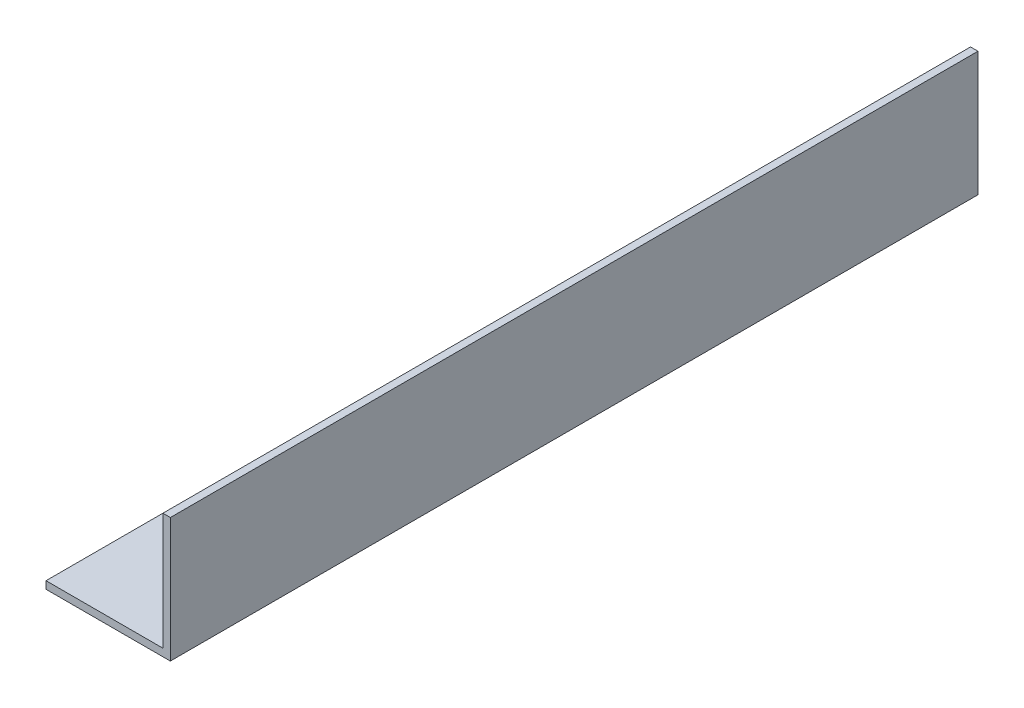
ISO-10303-21;
HEADER;
FILE_DESCRIPTION(('STEP AP214'),'2;1');
FILE_NAME('part.step','',(''),(''),'','','');
FILE_SCHEMA(('AUTOMOTIVE_DESIGN { 1 0 10303 214 1 1 1 1 }'));
ENDSEC;
DATA;
#1=APPLICATION_CONTEXT('core data for automotive mechanical design processes');
#2=APPLICATION_PROTOCOL_DEFINITION('international standard','automotive_design',2000,#1);
#3=PRODUCT_CONTEXT('',#1,'mechanical');
#4=PRODUCT('Part','Part','',(#3));
#5=PRODUCT_RELATED_PRODUCT_CATEGORY('part','',(#4));
#6=PRODUCT_DEFINITION_FORMATION('','',#4);
#7=PRODUCT_DEFINITION_CONTEXT('part definition',#1,'design');
#8=PRODUCT_DEFINITION('design','',#6,#7);
#9=PRODUCT_DEFINITION_SHAPE('','',#8);
#10=(LENGTH_UNIT() NAMED_UNIT(*) SI_UNIT(.MILLI.,.METRE.));
#11=(NAMED_UNIT(*) PLANE_ANGLE_UNIT() SI_UNIT($,.RADIAN.));
#12=(NAMED_UNIT(*) SI_UNIT($,.STERADIAN.) SOLID_ANGLE_UNIT());
#13=UNCERTAINTY_MEASURE_WITH_UNIT(LENGTH_MEASURE(1.E-05),#10,'distance_accuracy_value','');
#14=(GEOMETRIC_REPRESENTATION_CONTEXT(3) GLOBAL_UNCERTAINTY_ASSIGNED_CONTEXT((#13)) GLOBAL_UNIT_ASSIGNED_CONTEXT((#10,
#11,#12)) REPRESENTATION_CONTEXT('',''));
#15=CARTESIAN_POINT('',(0.,0.,0.));
#16=DIRECTION('',(0.,0.,1.));
#17=DIRECTION('',(1.,0.,0.));
#18=AXIS2_PLACEMENT_3D('',#15,#16,#17);
#19=CARTESIAN_POINT('',(-50.,0.,-304.8));
#20=DIRECTION('',(-1.,0.,0.));
#21=DIRECTION('',(0.,0.,1.));
#22=AXIS2_PLACEMENT_3D('',#19,#20,#21);
#23=PLANE('',#22);
#24=DIRECTION('',(0.,0.,1.));
#25=VECTOR('',#24,1.);
#26=CARTESIAN_POINT('',(-50.,0.,-304.8));
#27=LINE('',#26,#25);
#28=CARTESIAN_POINT('',(-50.,0.,-304.8));
#29=VERTEX_POINT('',#28);
#30=CARTESIAN_POINT('',(-50.,0.,20.));
#31=VERTEX_POINT('',#30);
#32=EDGE_CURVE('E50',#29,#31,#27,.T.);
#33=ORIENTED_EDGE('',*,*,#32,.T.);
#34=DIRECTION('',(0.,-1.,0.));
#35=VECTOR('',#34,1.);
#36=CARTESIAN_POINT('',(-50.,0.,20.));
#37=LINE('',#36,#35);
#38=CARTESIAN_POINT('',(-50.,2.99999999999999,20.));
#39=VERTEX_POINT('',#38);
#40=EDGE_CURVE('E100',#39,#31,#37,.T.);
#41=ORIENTED_EDGE('',*,*,#40,.F.);
#42=DIRECTION('',(0.,0.,1.));
#43=VECTOR('',#42,1.);
#44=CARTESIAN_POINT('',(-50.,2.99999999999999,-304.8));
#45=LINE('',#44,#43);
#46=CARTESIAN_POINT('',(-50.,2.99999999999999,-304.8));
#47=VERTEX_POINT('',#46);
#48=EDGE_CURVE('E11',#47,#39,#45,.T.);
#49=ORIENTED_EDGE('',*,*,#48,.F.);
#50=DIRECTION('',(0.,-1.,0.));
#51=VECTOR('',#50,1.);
#52=CARTESIAN_POINT('',(-50.,0.,-304.8));
#53=LINE('',#52,#51);
#54=EDGE_CURVE('E101',#47,#29,#53,.T.);
#55=ORIENTED_EDGE('',*,*,#54,.T.);
#56=EDGE_LOOP('',(#33,#41,#49,#55));
#57=FACE_BOUND('',#56,.T.);
#58=ADVANCED_FACE('F47',(#57),#23,.T.);
#59=CARTESIAN_POINT('',(-2.99999999999999,3.,-304.8));
#60=DIRECTION('',(0.,1.,0.));
#61=DIRECTION('',(-1.,0.,0.));
#62=AXIS2_PLACEMENT_3D('',#59,#60,#61);
#63=PLANE('',#62);
#64=CARTESIAN_POINT('',(-37.,3.,-105.61));
#65=DIRECTION('',(0.,1.,0.));
#66=DIRECTION('',(-1.,0.,0.));
#67=AXIS2_PLACEMENT_3D('',#64,#65,#66);
#68=CIRCLE('',#67,2.58499999999999);
#69=CARTESIAN_POINT('',(-39.585,3.,-105.61));
#70=VERTEX_POINT('',#69);
#71=EDGE_CURVE('E122',#70,#70,#68,.F.);
#72=ORIENTED_EDGE('',*,*,#71,.T.);
#73=EDGE_LOOP('',(#72));
#74=FACE_BOUND('',#73,.T.);
#75=CARTESIAN_POINT('',(-16.,3.,-179.19));
#76=DIRECTION('',(0.,1.,0.));
#77=DIRECTION('',(-1.,0.,0.));
#78=AXIS2_PLACEMENT_3D('',#75,#76,#77);
#79=CIRCLE('',#78,2.58499999999999);
#80=CARTESIAN_POINT('',(-18.585,3.,-179.19));
#81=VERTEX_POINT('',#80);
#82=EDGE_CURVE('E126',#81,#81,#79,.F.);
#83=ORIENTED_EDGE('',*,*,#82,.T.);
#84=EDGE_LOOP('',(#83));
#85=FACE_BOUND('',#84,.T.);
#86=CARTESIAN_POINT('',(-37.,3.,-179.19));
#87=DIRECTION('',(0.,1.,0.));
#88=DIRECTION('',(-1.,0.,0.));
#89=AXIS2_PLACEMENT_3D('',#86,#87,#88);
#90=CIRCLE('',#89,2.58499999999999);
#91=CARTESIAN_POINT('',(-39.585,3.,-179.19));
#92=VERTEX_POINT('',#91);
#93=EDGE_CURVE('E262',#92,#92,#90,.F.);
#94=ORIENTED_EDGE('',*,*,#93,.T.);
#95=EDGE_LOOP('',(#94));
#96=FACE_BOUND('',#95,.T.);
#97=CARTESIAN_POINT('',(-16.,3.,-151.19));
#98=DIRECTION('',(0.,1.,0.));
#99=DIRECTION('',(-1.,0.,0.));
#100=AXIS2_PLACEMENT_3D('',#97,#98,#99);
#101=CIRCLE('',#100,2.58499999999999);
#102=CARTESIAN_POINT('',(-18.585,3.,-151.19));
#103=VERTEX_POINT('',#102);
#104=EDGE_CURVE('E258',#103,#103,#101,.F.);
#105=ORIENTED_EDGE('',*,*,#104,.T.);
#106=EDGE_LOOP('',(#105));
#107=FACE_BOUND('',#106,.T.);
#108=CARTESIAN_POINT('',(-16.,3.,-105.61));
#109=DIRECTION('',(0.,1.,0.));
#110=DIRECTION('',(-1.,0.,0.));
#111=AXIS2_PLACEMENT_3D('',#108,#109,#110);
#112=CIRCLE('',#111,2.58499999999999);
#113=CARTESIAN_POINT('',(-18.585,3.,-105.61));
#114=VERTEX_POINT('',#113);
#115=EDGE_CURVE('E254',#114,#114,#112,.F.);
#116=ORIENTED_EDGE('',*,*,#115,.T.);
#117=EDGE_LOOP('',(#116));
#118=FACE_BOUND('',#117,.T.);
#119=CARTESIAN_POINT('',(-16.,3.,-133.61));
#120=DIRECTION('',(0.,1.,0.));
#121=DIRECTION('',(-1.,0.,0.));
#122=AXIS2_PLACEMENT_3D('',#119,#120,#121);
#123=CIRCLE('',#122,2.58499999999999);
#124=CARTESIAN_POINT('',(-18.585,3.,-133.61));
#125=VERTEX_POINT('',#124);
#126=EDGE_CURVE('E250',#125,#125,#123,.F.);
#127=ORIENTED_EDGE('',*,*,#126,.T.);
#128=EDGE_LOOP('',(#127));
#129=FACE_BOUND('',#128,.T.);
#130=CARTESIAN_POINT('',(-37.,3.,-133.61));
#131=DIRECTION('',(0.,1.,0.));
#132=DIRECTION('',(-1.,0.,0.));
#133=AXIS2_PLACEMENT_3D('',#130,#131,#132);
#134=CIRCLE('',#133,2.58499999999998);
#135=CARTESIAN_POINT('',(-39.585,3.,-133.61));
#136=VERTEX_POINT('',#135);
#137=EDGE_CURVE('E242',#136,#136,#134,.F.);
#138=ORIENTED_EDGE('',*,*,#137,.T.);
#139=EDGE_LOOP('',(#138));
#140=FACE_BOUND('',#139,.T.);
#141=CARTESIAN_POINT('',(-37.,3.,-151.19));
#142=DIRECTION('',(0.,1.,0.));
#143=DIRECTION('',(-1.,0.,0.));
#144=AXIS2_PLACEMENT_3D('',#141,#142,#143);
#145=CIRCLE('',#144,2.58499999999998);
#146=CARTESIAN_POINT('',(-39.585,3.,-151.19));
#147=VERTEX_POINT('',#146);
#148=EDGE_CURVE('E237',#147,#147,#145,.F.);
#149=ORIENTED_EDGE('',*,*,#148,.T.);
#150=EDGE_LOOP('',(#149));
#151=FACE_BOUND('',#150,.T.);
#152=ORIENTED_EDGE('',*,*,#48,.T.);
#153=DIRECTION('',(-1.,0.,0.));
#154=VECTOR('',#153,1.);
#155=CARTESIAN_POINT('',(-2.99999999999999,3.,20.));
#156=LINE('',#155,#154);
#157=CARTESIAN_POINT('',(-2.99999999999999,3.,20.));
#158=VERTEX_POINT('',#157);
#159=EDGE_CURVE('E120',#158,#39,#156,.T.);
#160=ORIENTED_EDGE('',*,*,#159,.F.);
#161=DIRECTION('',(0.,0.,1.));
#162=VECTOR('',#161,1.);
#163=CARTESIAN_POINT('',(-2.99999999999999,3.,-304.8));
#164=LINE('',#163,#162);
#165=CARTESIAN_POINT('',(-2.99999999999999,3.,-304.8));
#166=VERTEX_POINT('',#165);
#167=EDGE_CURVE('E56',#166,#158,#164,.T.);
#168=ORIENTED_EDGE('',*,*,#167,.F.);
#169=DIRECTION('',(-1.,0.,0.));
#170=VECTOR('',#169,1.);
#171=CARTESIAN_POINT('',(-2.99999999999999,3.,-304.8));
#172=LINE('',#171,#170);
#173=EDGE_CURVE('E107',#166,#47,#172,.T.);
#174=ORIENTED_EDGE('',*,*,#173,.T.);
#175=EDGE_LOOP('',(#152,#160,#168,#174));
#176=FACE_BOUND('',#175,.T.);
#177=ADVANCED_FACE('F181',(#74,#85,#96,#107,#118,#129,#140,#151,#176),#63,.T.);
#178=CARTESIAN_POINT('',(-2.99999999999999,50.,-304.8));
#179=DIRECTION('',(-1.,0.,0.));
#180=DIRECTION('',(0.,-1.,0.));
#181=AXIS2_PLACEMENT_3D('',#178,#179,#180);
#182=PLANE('',#181);
#183=ORIENTED_EDGE('',*,*,#167,.T.);
#184=DIRECTION('',(0.,-1.,0.));
#185=VECTOR('',#184,1.);
#186=CARTESIAN_POINT('',(-2.99999999999999,50.,20.));
#187=LINE('',#186,#185);
#188=CARTESIAN_POINT('',(-2.99999999999999,50.,20.));
#189=VERTEX_POINT('',#188);
#190=EDGE_CURVE('E136',#189,#158,#187,.T.);
#191=ORIENTED_EDGE('',*,*,#190,.F.);
#192=DIRECTION('',(0.,0.,1.));
#193=VECTOR('',#192,1.);
#194=CARTESIAN_POINT('',(-2.99999999999999,50.,-304.8));
#195=LINE('',#194,#193);
#196=CARTESIAN_POINT('',(-2.99999999999999,50.,-304.8));
#197=VERTEX_POINT('',#196);
#198=EDGE_CURVE('E161',#197,#189,#195,.T.);
#199=ORIENTED_EDGE('',*,*,#198,.F.);
#200=DIRECTION('',(0.,-1.,0.));
#201=VECTOR('',#200,1.);
#202=CARTESIAN_POINT('',(-2.99999999999999,50.,-304.8));
#203=LINE('',#202,#201);
#204=EDGE_CURVE('E154',#197,#166,#203,.T.);
#205=ORIENTED_EDGE('',*,*,#204,.T.);
#206=EDGE_LOOP('',(#183,#191,#199,#205));
#207=FACE_BOUND('',#206,.T.);
#208=ADVANCED_FACE('F177',(#207),#182,.T.);
#209=CARTESIAN_POINT('',(0.,50.,-304.8));
#210=DIRECTION('',(0.,1.,0.));
#211=DIRECTION('',(0.,0.,1.));
#212=AXIS2_PLACEMENT_3D('',#209,#210,#211);
#213=PLANE('',#212);
#214=ORIENTED_EDGE('',*,*,#198,.T.);
#215=DIRECTION('',(-1.,0.,0.));
#216=VECTOR('',#215,1.);
#217=CARTESIAN_POINT('',(0.,50.,20.));
#218=LINE('',#217,#216);
#219=CARTESIAN_POINT('',(0.,50.,20.));
#220=VERTEX_POINT('',#219);
#221=EDGE_CURVE('E132',#220,#189,#218,.T.);
#222=ORIENTED_EDGE('',*,*,#221,.F.);
#223=DIRECTION('',(0.,0.,1.));
#224=VECTOR('',#223,1.);
#225=CARTESIAN_POINT('',(0.,50.,-304.8));
#226=LINE('',#225,#224);
#227=CARTESIAN_POINT('',(0.,50.,-304.8));
#228=VERTEX_POINT('',#227);
#229=EDGE_CURVE('E164',#228,#220,#226,.T.);
#230=ORIENTED_EDGE('',*,*,#229,.F.);
#231=DIRECTION('',(-1.,0.,0.));
#232=VECTOR('',#231,1.);
#233=CARTESIAN_POINT('',(0.,50.,-304.8));
#234=LINE('',#233,#232);
#235=EDGE_CURVE('E150',#228,#197,#234,.T.);
#236=ORIENTED_EDGE('',*,*,#235,.T.);
#237=EDGE_LOOP('',(#214,#222,#230,#236));
#238=FACE_BOUND('',#237,.T.);
#239=ADVANCED_FACE('F174',(#238),#213,.T.);
#240=CARTESIAN_POINT('',(0.,0.,-304.8));
#241=DIRECTION('',(1.,0.,0.));
#242=DIRECTION('',(0.,0.,-1.));
#243=AXIS2_PLACEMENT_3D('',#240,#241,#242);
#244=PLANE('',#243);
#245=ORIENTED_EDGE('',*,*,#229,.T.);
#246=DIRECTION('',(0.,1.,0.));
#247=VECTOR('',#246,1.);
#248=CARTESIAN_POINT('',(0.,0.,20.));
#249=LINE('',#248,#247);
#250=CARTESIAN_POINT('',(0.,0.,20.));
#251=VERTEX_POINT('',#250);
#252=EDGE_CURVE('E115',#251,#220,#249,.T.);
#253=ORIENTED_EDGE('',*,*,#252,.F.);
#254=DIRECTION('',(0.,0.,1.));
#255=VECTOR('',#254,1.);
#256=CARTESIAN_POINT('',(0.,0.,-304.8));
#257=LINE('',#256,#255);
#258=CARTESIAN_POINT('',(0.,0.,-304.8));
#259=VERTEX_POINT('',#258);
#260=EDGE_CURVE('E106',#259,#251,#257,.T.);
#261=ORIENTED_EDGE('',*,*,#260,.F.);
#262=DIRECTION('',(0.,1.,0.));
#263=VECTOR('',#262,1.);
#264=CARTESIAN_POINT('',(0.,0.,-304.8));
#265=LINE('',#264,#263);
#266=EDGE_CURVE('E146',#259,#228,#265,.T.);
#267=ORIENTED_EDGE('',*,*,#266,.T.);
#268=EDGE_LOOP('',(#245,#253,#261,#267));
#269=FACE_BOUND('',#268,.T.);
#270=ADVANCED_FACE('F168',(#269),#244,.T.);
#271=CARTESIAN_POINT('',(-50.,0.,-304.8));
#272=DIRECTION('',(0.,-1.,0.));
#273=DIRECTION('',(0.,0.,-1.));
#274=AXIS2_PLACEMENT_3D('',#271,#272,#273);
#275=PLANE('',#274);
#276=CARTESIAN_POINT('',(-37.,0.,-105.61));
#277=DIRECTION('',(0.,1.,0.));
#278=DIRECTION('',(0.,0.,-1.));
#279=AXIS2_PLACEMENT_3D('',#276,#277,#278);
#280=CIRCLE('',#279,2.58499999999999);
#281=CARTESIAN_POINT('',(-37.,0.,-108.195));
#282=VERTEX_POINT('',#281);
#283=EDGE_CURVE('E207',#282,#282,#280,.T.);
#284=ORIENTED_EDGE('',*,*,#283,.T.);
#285=EDGE_LOOP('',(#284));
#286=FACE_BOUND('',#285,.T.);
#287=CARTESIAN_POINT('',(-16.,0.,-179.19));
#288=DIRECTION('',(0.,1.,0.));
#289=DIRECTION('',(0.,0.,-1.));
#290=AXIS2_PLACEMENT_3D('',#287,#288,#289);
#291=CIRCLE('',#290,2.58499999999999);
#292=CARTESIAN_POINT('',(-16.,0.,-181.775));
#293=VERTEX_POINT('',#292);
#294=EDGE_CURVE('E211',#293,#293,#291,.T.);
#295=ORIENTED_EDGE('',*,*,#294,.T.);
#296=EDGE_LOOP('',(#295));
#297=FACE_BOUND('',#296,.T.);
#298=CARTESIAN_POINT('',(-37.,0.,-179.19));
#299=DIRECTION('',(0.,1.,0.));
#300=DIRECTION('',(0.,0.,1.));
#301=AXIS2_PLACEMENT_3D('',#298,#299,#300);
#302=CIRCLE('',#301,2.58499999999999);
#303=CARTESIAN_POINT('',(-37.,0.,-176.605));
#304=VERTEX_POINT('',#303);
#305=EDGE_CURVE('E215',#304,#304,#302,.T.);
#306=ORIENTED_EDGE('',*,*,#305,.T.);
#307=EDGE_LOOP('',(#306));
#308=FACE_BOUND('',#307,.T.);
#309=CARTESIAN_POINT('',(-16.,0.,-151.19));
#310=DIRECTION('',(0.,1.,0.));
#311=DIRECTION('',(0.,0.,-1.));
#312=AXIS2_PLACEMENT_3D('',#309,#310,#311);
#313=CIRCLE('',#312,2.58499999999999);
#314=CARTESIAN_POINT('',(-16.,0.,-153.775));
#315=VERTEX_POINT('',#314);
#316=EDGE_CURVE('E219',#315,#315,#313,.T.);
#317=ORIENTED_EDGE('',*,*,#316,.T.);
#318=EDGE_LOOP('',(#317));
#319=FACE_BOUND('',#318,.T.);
#320=CARTESIAN_POINT('',(-16.,0.,-105.61));
#321=DIRECTION('',(0.,1.,0.));
#322=DIRECTION('',(0.,0.,1.));
#323=AXIS2_PLACEMENT_3D('',#320,#321,#322);
#324=CIRCLE('',#323,2.58499999999999);
#325=CARTESIAN_POINT('',(-16.,0.,-103.025));
#326=VERTEX_POINT('',#325);
#327=EDGE_CURVE('E223',#326,#326,#324,.T.);
#328=ORIENTED_EDGE('',*,*,#327,.T.);
#329=EDGE_LOOP('',(#328));
#330=FACE_BOUND('',#329,.T.);
#331=CARTESIAN_POINT('',(-16.,0.,-133.61));
#332=DIRECTION('',(0.,1.,0.));
#333=DIRECTION('',(0.,0.,1.));
#334=AXIS2_PLACEMENT_3D('',#331,#332,#333);
#335=CIRCLE('',#334,2.58499999999999);
#336=CARTESIAN_POINT('',(-16.,0.,-131.025));
#337=VERTEX_POINT('',#336);
#338=EDGE_CURVE('E227',#337,#337,#335,.T.);
#339=ORIENTED_EDGE('',*,*,#338,.T.);
#340=EDGE_LOOP('',(#339));
#341=FACE_BOUND('',#340,.T.);
#342=CARTESIAN_POINT('',(-37.,0.,-133.61));
#343=DIRECTION('',(0.,1.,0.));
#344=DIRECTION('',(0.,0.,-1.));
#345=AXIS2_PLACEMENT_3D('',#342,#343,#344);
#346=CIRCLE('',#345,2.58499999999998);
#347=CARTESIAN_POINT('',(-37.,0.,-136.195));
#348=VERTEX_POINT('',#347);
#349=EDGE_CURVE('E231',#348,#348,#346,.T.);
#350=ORIENTED_EDGE('',*,*,#349,.T.);
#351=EDGE_LOOP('',(#350));
#352=FACE_BOUND('',#351,.T.);
#353=CARTESIAN_POINT('',(-37.,0.,-151.19));
#354=DIRECTION('',(0.,1.,0.));
#355=DIRECTION('',(0.,0.,1.));
#356=AXIS2_PLACEMENT_3D('',#353,#354,#355);
#357=CIRCLE('',#356,2.58499999999998);
#358=CARTESIAN_POINT('',(-37.,0.,-148.605));
#359=VERTEX_POINT('',#358);
#360=EDGE_CURVE('E234',#359,#359,#357,.T.);
#361=ORIENTED_EDGE('',*,*,#360,.T.);
#362=EDGE_LOOP('',(#361));
#363=FACE_BOUND('',#362,.T.);
#364=ORIENTED_EDGE('',*,*,#260,.T.);
#365=DIRECTION('',(1.,0.,0.));
#366=VECTOR('',#365,1.);
#367=CARTESIAN_POINT('',(-50.,0.,20.));
#368=LINE('',#367,#366);
#369=EDGE_CURVE('E109',#31,#251,#368,.T.);
#370=ORIENTED_EDGE('',*,*,#369,.F.);
#371=ORIENTED_EDGE('',*,*,#32,.F.);
#372=DIRECTION('',(1.,0.,0.));
#373=VECTOR('',#372,1.);
#374=CARTESIAN_POINT('',(-50.,0.,-304.8));
#375=LINE('',#374,#373);
#376=EDGE_CURVE('E143',#29,#259,#375,.T.);
#377=ORIENTED_EDGE('',*,*,#376,.T.);
#378=EDGE_LOOP('',(#364,#370,#371,#377));
#379=FACE_BOUND('',#378,.T.);
#380=ADVANCED_FACE('F110',(#286,#297,#308,#319,#330,#341,#352,#363,#379),#275,.T.);
#381=CARTESIAN_POINT('',(0.,0.,-304.8));
#382=DIRECTION('',(0.,0.,1.));
#383=DIRECTION('',(1.,0.,0.));
#384=AXIS2_PLACEMENT_3D('',#381,#382,#383);
#385=PLANE('',#384);
#386=ORIENTED_EDGE('',*,*,#54,.F.);
#387=ORIENTED_EDGE('',*,*,#173,.F.);
#388=ORIENTED_EDGE('',*,*,#204,.F.);
#389=ORIENTED_EDGE('',*,*,#235,.F.);
#390=ORIENTED_EDGE('',*,*,#266,.F.);
#391=ORIENTED_EDGE('',*,*,#376,.F.);
#392=EDGE_LOOP('',(#386,#387,#388,#389,#390,#391));
#393=FACE_BOUND('',#392,.T.);
#394=ADVANCED_FACE('F180',(#393),#385,.F.);
#395=CARTESIAN_POINT('',(0.,0.,20.));
#396=DIRECTION('',(0.,0.,1.));
#397=DIRECTION('',(1.,0.,0.));
#398=AXIS2_PLACEMENT_3D('',#395,#396,#397);
#399=PLANE('',#398);
#400=ORIENTED_EDGE('',*,*,#40,.T.);
#401=ORIENTED_EDGE('',*,*,#369,.T.);
#402=ORIENTED_EDGE('',*,*,#252,.T.);
#403=ORIENTED_EDGE('',*,*,#221,.T.);
#404=ORIENTED_EDGE('',*,*,#190,.T.);
#405=ORIENTED_EDGE('',*,*,#159,.T.);
#406=EDGE_LOOP('',(#400,#401,#402,#403,#404,#405));
#407=FACE_BOUND('',#406,.T.);
#408=ADVANCED_FACE('F118',(#407),#399,.T.);
#409=CARTESIAN_POINT('',(-37.,50.,-151.19));
#410=DIRECTION('',(0.,-1.,0.));
#411=DIRECTION('',(0.,0.,-1.));
#412=AXIS2_PLACEMENT_3D('',#409,#410,#411);
#413=CYLINDRICAL_SURFACE('',#412,2.58499999999998);
#414=ORIENTED_EDGE('',*,*,#148,.F.);
#415=EDGE_LOOP('',(#414));
#416=FACE_BOUND('',#415,.T.);
#417=ORIENTED_EDGE('',*,*,#360,.F.);
#418=EDGE_LOOP('',(#417));
#419=FACE_BOUND('',#418,.T.);
#420=ADVANCED_FACE('F304',(#416,#419),#413,.F.);
#421=CARTESIAN_POINT('',(-37.,50.,-133.61));
#422=DIRECTION('',(0.,-1.,0.));
#423=DIRECTION('',(0.,0.,-1.));
#424=AXIS2_PLACEMENT_3D('',#421,#422,#423);
#425=CYLINDRICAL_SURFACE('',#424,2.58499999999998);
#426=ORIENTED_EDGE('',*,*,#137,.F.);
#427=EDGE_LOOP('',(#426));
#428=FACE_BOUND('',#427,.T.);
#429=ORIENTED_EDGE('',*,*,#349,.F.);
#430=EDGE_LOOP('',(#429));
#431=FACE_BOUND('',#430,.T.);
#432=ADVANCED_FACE('F297',(#428,#431),#425,.F.);
#433=CARTESIAN_POINT('',(-16.,50.,-133.61));
#434=DIRECTION('',(0.,-1.,0.));
#435=DIRECTION('',(0.,0.,-1.));
#436=AXIS2_PLACEMENT_3D('',#433,#434,#435);
#437=CYLINDRICAL_SURFACE('',#436,2.58499999999999);
#438=ORIENTED_EDGE('',*,*,#126,.F.);
#439=EDGE_LOOP('',(#438));
#440=FACE_BOUND('',#439,.T.);
#441=ORIENTED_EDGE('',*,*,#338,.F.);
#442=EDGE_LOOP('',(#441));
#443=FACE_BOUND('',#442,.T.);
#444=ADVANCED_FACE('F362',(#440,#443),#437,.F.);
#445=CARTESIAN_POINT('',(-16.,50.,-105.61));
#446=DIRECTION('',(0.,-1.,0.));
#447=DIRECTION('',(0.,0.,-1.));
#448=AXIS2_PLACEMENT_3D('',#445,#446,#447);
#449=CYLINDRICAL_SURFACE('',#448,2.58499999999999);
#450=ORIENTED_EDGE('',*,*,#115,.F.);
#451=EDGE_LOOP('',(#450));
#452=FACE_BOUND('',#451,.T.);
#453=ORIENTED_EDGE('',*,*,#327,.F.);
#454=EDGE_LOOP('',(#453));
#455=FACE_BOUND('',#454,.T.);
#456=ADVANCED_FACE('F301',(#452,#455),#449,.F.);
#457=CARTESIAN_POINT('',(-16.,50.,-151.19));
#458=DIRECTION('',(0.,-1.,0.));
#459=DIRECTION('',(0.,0.,-1.));
#460=AXIS2_PLACEMENT_3D('',#457,#458,#459);
#461=CYLINDRICAL_SURFACE('',#460,2.58499999999999);
#462=ORIENTED_EDGE('',*,*,#104,.F.);
#463=EDGE_LOOP('',(#462));
#464=FACE_BOUND('',#463,.T.);
#465=ORIENTED_EDGE('',*,*,#316,.F.);
#466=EDGE_LOOP('',(#465));
#467=FACE_BOUND('',#466,.T.);
#468=ADVANCED_FACE('F293',(#464,#467),#461,.F.);
#469=CARTESIAN_POINT('',(-37.,50.,-179.19));
#470=DIRECTION('',(0.,-1.,0.));
#471=DIRECTION('',(0.,0.,-1.));
#472=AXIS2_PLACEMENT_3D('',#469,#470,#471);
#473=CYLINDRICAL_SURFACE('',#472,2.58499999999999);
#474=ORIENTED_EDGE('',*,*,#93,.F.);
#475=EDGE_LOOP('',(#474));
#476=FACE_BOUND('',#475,.T.);
#477=ORIENTED_EDGE('',*,*,#305,.F.);
#478=EDGE_LOOP('',(#477));
#479=FACE_BOUND('',#478,.T.);
#480=ADVANCED_FACE('F274',(#476,#479),#473,.F.);
#481=CARTESIAN_POINT('',(-16.,50.,-179.19));
#482=DIRECTION('',(0.,-1.,0.));
#483=DIRECTION('',(0.,0.,-1.));
#484=AXIS2_PLACEMENT_3D('',#481,#482,#483);
#485=CYLINDRICAL_SURFACE('',#484,2.58499999999999);
#486=ORIENTED_EDGE('',*,*,#82,.F.);
#487=EDGE_LOOP('',(#486));
#488=FACE_BOUND('',#487,.T.);
#489=ORIENTED_EDGE('',*,*,#294,.F.);
#490=EDGE_LOOP('',(#489));
#491=FACE_BOUND('',#490,.T.);
#492=ADVANCED_FACE('F270',(#488,#491),#485,.F.);
#493=CARTESIAN_POINT('',(-37.,50.,-105.61));
#494=DIRECTION('',(0.,-1.,0.));
#495=DIRECTION('',(0.,0.,-1.));
#496=AXIS2_PLACEMENT_3D('',#493,#494,#495);
#497=CYLINDRICAL_SURFACE('',#496,2.58499999999999);
#498=ORIENTED_EDGE('',*,*,#71,.F.);
#499=EDGE_LOOP('',(#498));
#500=FACE_BOUND('',#499,.T.);
#501=ORIENTED_EDGE('',*,*,#283,.F.);
#502=EDGE_LOOP('',(#501));
#503=FACE_BOUND('',#502,.T.);
#504=ADVANCED_FACE('F273',(#500,#503),#497,.F.);
#505=CLOSED_SHELL('',(#58,#177,#208,#239,#270,#380,#394,#408,#420,#432,#444,#456,#468,#480,#492,#504));
#506=MANIFOLD_SOLID_BREP('B2',#505);
#507=ADVANCED_BREP_SHAPE_REPRESENTATION('',(#18,#506),#14);
#508=SHAPE_DEFINITION_REPRESENTATION(#9,#507);
ENDSEC;
END-ISO-10303-21;
